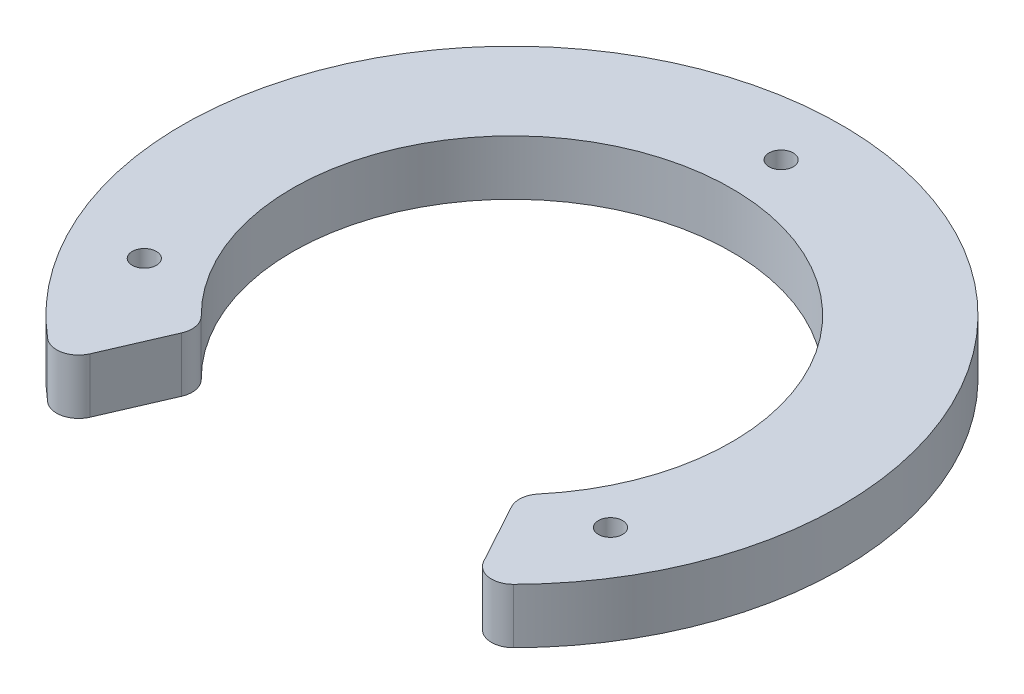
ISO-10303-21;
HEADER;
FILE_DESCRIPTION(('STEP AP214'),'2;1');
FILE_NAME('part.step','',(''),(''),'','','');
FILE_SCHEMA(('AUTOMOTIVE_DESIGN { 1 0 10303 214 1 1 1 1 }'));
ENDSEC;
DATA;
#1=APPLICATION_CONTEXT('core data for automotive mechanical design processes');
#2=APPLICATION_PROTOCOL_DEFINITION('international standard','automotive_design',2000,#1);
#3=PRODUCT_CONTEXT('',#1,'mechanical');
#4=PRODUCT('Part','Part','',(#3));
#5=PRODUCT_RELATED_PRODUCT_CATEGORY('part','',(#4));
#6=PRODUCT_DEFINITION_FORMATION('','',#4);
#7=PRODUCT_DEFINITION_CONTEXT('part definition',#1,'design');
#8=PRODUCT_DEFINITION('design','',#6,#7);
#9=PRODUCT_DEFINITION_SHAPE('','',#8);
#10=(LENGTH_UNIT() NAMED_UNIT(*) SI_UNIT(.MILLI.,.METRE.));
#11=(NAMED_UNIT(*) PLANE_ANGLE_UNIT() SI_UNIT($,.RADIAN.));
#12=(NAMED_UNIT(*) SI_UNIT($,.STERADIAN.) SOLID_ANGLE_UNIT());
#13=UNCERTAINTY_MEASURE_WITH_UNIT(LENGTH_MEASURE(1.E-05),#10,'distance_accuracy_value','');
#14=(GEOMETRIC_REPRESENTATION_CONTEXT(3) GLOBAL_UNCERTAINTY_ASSIGNED_CONTEXT((#13)) GLOBAL_UNIT_ASSIGNED_CONTEXT((#10,
#11,#12)) REPRESENTATION_CONTEXT('',''));
#15=CARTESIAN_POINT('',(0.,0.,0.));
#16=DIRECTION('',(0.,0.,1.));
#17=DIRECTION('',(1.,0.,0.));
#18=AXIS2_PLACEMENT_3D('',#15,#16,#17);
#19=CARTESIAN_POINT('',(0.,5.,0.));
#20=DIRECTION('',(0.,1.,0.));
#21=DIRECTION('',(0.,0.,1.));
#22=AXIS2_PLACEMENT_3D('',#19,#20,#21);
#23=PLANE('',#22);
#24=CARTESIAN_POINT('',(0.,5.,0.));
#25=DIRECTION('',(0.,1.,0.));
#26=DIRECTION('',(0.,0.,1.));
#27=AXIS2_PLACEMENT_3D('',#24,#25,#26);
#28=CIRCLE('',#27,20.);
#29=CARTESIAN_POINT('',(15.3041006050472,5.,12.8757331702157));
#30=VERTEX_POINT('',#29);
#31=CARTESIAN_POINT('',(-14.0733854628209,5.,14.2105531776515));
#32=VERTEX_POINT('',#31);
#33=EDGE_CURVE('E151',#30,#32,#28,.T.);
#34=ORIENTED_EDGE('',*,*,#33,.F.);
#35=CARTESIAN_POINT('',(16.8345106655519,5.,14.1633064872373));
#36=DIRECTION('',(0.,1.,0.));
#37=DIRECTION('',(0.,0.,1.));
#38=AXIS2_PLACEMENT_3D('',#35,#36,#37);
#39=CIRCLE('',#38,2.);
#40=CARTESIAN_POINT('',(15.07857060836,5.,15.1207376939298));
#41=VERTEX_POINT('',#40);
#42=EDGE_CURVE('E113',#30,#41,#39,.T.);
#43=ORIENTED_EDGE('',*,*,#42,.T.);
#44=DIRECTION('',(-0.478715603346275,0.,-0.877970028595972));
#45=VECTOR('',#44,1.);
#46=CARTESIAN_POINT('',(19.3391276928733,5.,22.9346493341133));
#47=LINE('',#46,#45);
#48=CARTESIAN_POINT('',(18.1131077432541,5.,20.6861143736855));
#49=VERTEX_POINT('',#48);
#50=EDGE_CURVE('E121',#49,#41,#47,.T.);
#51=ORIENTED_EDGE('',*,*,#50,.F.);
#52=CARTESIAN_POINT('',(19.869047800446,5.,19.7286831669929));
#53=DIRECTION('',(0.,1.,0.));
#54=DIRECTION('',(0.,0.,1.));
#55=AXIS2_PLACEMENT_3D('',#52,#53,#54);
#56=CIRCLE('',#55,2.);
#57=CARTESIAN_POINT('',(21.2882655004779,5.,21.1378748217781));
#58=VERTEX_POINT('',#57);
#59=EDGE_CURVE('E64',#49,#58,#56,.T.);
#60=ORIENTED_EDGE('',*,*,#59,.T.);
#61=CARTESIAN_POINT('',(0.,5.,0.));
#62=DIRECTION('',(0.,1.,0.));
#63=DIRECTION('',(0.,0.,1.));
#64=AXIS2_PLACEMENT_3D('',#61,#62,#63);
#65=CIRCLE('',#64,30.);
#66=CARTESIAN_POINT('',(-19.2836282905954,5.,22.98133329357));
#67=VERTEX_POINT('',#66);
#68=EDGE_CURVE('E126',#58,#67,#65,.T.);
#69=ORIENTED_EDGE('',*,*,#68,.T.);
#70=CARTESIAN_POINT('',(-17.9980530712223,5.,21.449244407332));
#71=DIRECTION('',(0.,1.,0.));
#72=DIRECTION('',(0.,0.,1.));
#73=AXIS2_PLACEMENT_3D('',#70,#71,#72);
#74=CIRCLE('',#73,2.);
#75=CARTESIAN_POINT('',(-16.1625223383157,5.,22.2434905458529));
#76=VERTEX_POINT('',#75);
#77=EDGE_CURVE('E56',#67,#76,#74,.T.);
#78=ORIENTED_EDGE('',*,*,#77,.T.);
#79=DIRECTION('',(-0.397123069260438,0.,0.917765366453305));
#80=VECTOR('',#79,1.);
#81=CARTESIAN_POINT('',(-13.0832174698103,5.,15.1271087996897));
#82=LINE('',#81,#80);
#83=CARTESIAN_POINT('',(-13.6451932761963,5.,16.4258546339376));
#84=VERTEX_POINT('',#83);
#85=EDGE_CURVE('E131',#84,#76,#82,.T.);
#86=ORIENTED_EDGE('',*,*,#85,.F.);
#87=CARTESIAN_POINT('',(-15.4807240091029,5.,15.6316084954167));
#88=DIRECTION('',(0.,1.,0.));
#89=DIRECTION('',(0.,0.,1.));
#90=AXIS2_PLACEMENT_3D('',#87,#88,#89);
#91=CIRCLE('',#90,2.);
#92=EDGE_CURVE('E114',#84,#32,#91,.T.);
#93=ORIENTED_EDGE('',*,*,#92,.T.);
#94=EDGE_LOOP('',(#34,#43,#51,#60,#69,#78,#86,#93));
#95=FACE_BOUND('',#94,.T.);
#96=CARTESIAN_POINT('',(21.2176223927188,5.,12.25));
#97=DIRECTION('',(0.,1.,0.));
#98=DIRECTION('',(0.,0.,1.));
#99=AXIS2_PLACEMENT_3D('',#96,#97,#98);
#100=CIRCLE('',#99,1.1);
#101=CARTESIAN_POINT('',(21.2176223927188,5.,13.35));
#102=VERTEX_POINT('',#101);
#103=EDGE_CURVE('E165',#102,#102,#100,.T.);
#104=ORIENTED_EDGE('',*,*,#103,.F.);
#105=EDGE_LOOP('',(#104));
#106=FACE_BOUND('',#105,.T.);
#107=CARTESIAN_POINT('',(0.,5.,-24.5));
#108=DIRECTION('',(0.,1.,0.));
#109=DIRECTION('',(0.,0.,1.));
#110=AXIS2_PLACEMENT_3D('',#107,#108,#109);
#111=CIRCLE('',#110,1.1);
#112=CARTESIAN_POINT('',(0.,5.,-23.4));
#113=VERTEX_POINT('',#112);
#114=EDGE_CURVE('E152',#113,#113,#111,.T.);
#115=ORIENTED_EDGE('',*,*,#114,.F.);
#116=EDGE_LOOP('',(#115));
#117=FACE_BOUND('',#116,.T.);
#118=CARTESIAN_POINT('',(-21.2176223927187,5.,12.25));
#119=DIRECTION('',(0.,1.,0.));
#120=DIRECTION('',(0.,0.,1.));
#121=AXIS2_PLACEMENT_3D('',#118,#119,#120);
#122=CIRCLE('',#121,1.1);
#123=CARTESIAN_POINT('',(-21.2176223927187,5.,13.35));
#124=VERTEX_POINT('',#123);
#125=EDGE_CURVE('E171',#124,#124,#122,.T.);
#126=ORIENTED_EDGE('',*,*,#125,.F.);
#127=EDGE_LOOP('',(#126));
#128=FACE_BOUND('',#127,.T.);
#129=ADVANCED_FACE('F41',(#95,#106,#117,#128),#23,.T.);
#130=CARTESIAN_POINT('',(0.,0.,0.));
#131=DIRECTION('',(0.,1.,0.));
#132=DIRECTION('',(0.,0.,1.));
#133=AXIS2_PLACEMENT_3D('',#130,#131,#132);
#134=PLANE('',#133);
#135=DIRECTION('',(-0.478715603346275,0.,-0.877970028595972));
#136=VECTOR('',#135,1.);
#137=CARTESIAN_POINT('',(5.2678201715915,0.,-2.87229362008619));
#138=LINE('',#137,#136);
#139=CARTESIAN_POINT('',(18.1131077432541,0.,20.6861143736855));
#140=VERTEX_POINT('',#139);
#141=CARTESIAN_POINT('',(15.07857060836,0.,15.1207376939298));
#142=VERTEX_POINT('',#141);
#143=EDGE_CURVE('E124',#140,#142,#138,.T.);
#144=ORIENTED_EDGE('',*,*,#143,.T.);
#145=CARTESIAN_POINT('',(16.8345106655519,0.,14.1633064872373));
#146=DIRECTION('',(0.,1.,0.));
#147=DIRECTION('',(0.,0.,1.));
#148=AXIS2_PLACEMENT_3D('',#145,#146,#147);
#149=CIRCLE('',#148,2.);
#150=CARTESIAN_POINT('',(15.3041006050472,0.,12.8757331702157));
#151=VERTEX_POINT('',#150);
#152=EDGE_CURVE('E220',#142,#151,#149,.F.);
#153=ORIENTED_EDGE('',*,*,#152,.T.);
#154=CARTESIAN_POINT('',(0.,0.,0.));
#155=DIRECTION('',(0.,1.,0.));
#156=DIRECTION('',(0.,0.,1.));
#157=AXIS2_PLACEMENT_3D('',#154,#155,#156);
#158=CIRCLE('',#157,20.);
#159=CARTESIAN_POINT('',(-14.0733854628209,0.,14.2105531776515));
#160=VERTEX_POINT('',#159);
#161=EDGE_CURVE('E146',#151,#160,#158,.T.);
#162=ORIENTED_EDGE('',*,*,#161,.T.);
#163=CARTESIAN_POINT('',(-15.4807240091029,0.,15.6316084954167));
#164=DIRECTION('',(0.,1.,0.));
#165=DIRECTION('',(0.,0.,1.));
#166=AXIS2_PLACEMENT_3D('',#163,#164,#165);
#167=CIRCLE('',#166,2.);
#168=CARTESIAN_POINT('',(-13.6451932761963,0.,16.4258546339376));
#169=VERTEX_POINT('',#168);
#170=EDGE_CURVE('E213',#160,#169,#167,.F.);
#171=ORIENTED_EDGE('',*,*,#170,.T.);
#172=DIRECTION('',(-0.397123069260438,0.,0.917765366453305));
#173=VECTOR('',#172,1.);
#174=CARTESIAN_POINT('',(-5.50659219871929,0.,-2.3827384155624));
#175=LINE('',#174,#173);
#176=CARTESIAN_POINT('',(-16.1625223383157,0.,22.2434905458529));
#177=VERTEX_POINT('',#176);
#178=EDGE_CURVE('E138',#169,#177,#175,.T.);
#179=ORIENTED_EDGE('',*,*,#178,.T.);
#180=CARTESIAN_POINT('',(-17.9980530712223,0.,21.449244407332));
#181=DIRECTION('',(0.,1.,0.));
#182=DIRECTION('',(0.,0.,1.));
#183=AXIS2_PLACEMENT_3D('',#180,#181,#182);
#184=CIRCLE('',#183,2.);
#185=CARTESIAN_POINT('',(-19.2836282905954,0.,22.98133329357));
#186=VERTEX_POINT('',#185);
#187=EDGE_CURVE('E218',#177,#186,#184,.F.);
#188=ORIENTED_EDGE('',*,*,#187,.T.);
#189=CARTESIAN_POINT('',(0.,0.,0.));
#190=DIRECTION('',(0.,1.,0.));
#191=DIRECTION('',(0.,0.,1.));
#192=AXIS2_PLACEMENT_3D('',#189,#190,#191);
#193=CIRCLE('',#192,30.);
#194=CARTESIAN_POINT('',(21.2882655004779,0.,21.1378748217781));
#195=VERTEX_POINT('',#194);
#196=EDGE_CURVE('E155',#195,#186,#193,.T.);
#197=ORIENTED_EDGE('',*,*,#196,.F.);
#198=CARTESIAN_POINT('',(19.869047800446,0.,19.7286831669929));
#199=DIRECTION('',(0.,1.,0.));
#200=DIRECTION('',(0.,0.,1.));
#201=AXIS2_PLACEMENT_3D('',#198,#199,#200);
#202=CIRCLE('',#201,2.);
#203=EDGE_CURVE('E217',#195,#140,#202,.F.);
#204=ORIENTED_EDGE('',*,*,#203,.T.);
#205=EDGE_LOOP('',(#144,#153,#162,#171,#179,#188,#197,#204));
#206=FACE_BOUND('',#205,.T.);
#207=CARTESIAN_POINT('',(0.,0.,-24.5));
#208=DIRECTION('',(0.,1.,0.));
#209=DIRECTION('',(0.,0.,1.));
#210=AXIS2_PLACEMENT_3D('',#207,#208,#209);
#211=CIRCLE('',#210,1.1);
#212=CARTESIAN_POINT('',(0.,0.,-23.4));
#213=VERTEX_POINT('',#212);
#214=EDGE_CURVE('E161',#213,#213,#211,.T.);
#215=ORIENTED_EDGE('',*,*,#214,.T.);
#216=EDGE_LOOP('',(#215));
#217=FACE_BOUND('',#216,.T.);
#218=CARTESIAN_POINT('',(21.2176223927188,0.,12.25));
#219=DIRECTION('',(0.,1.,0.));
#220=DIRECTION('',(0.,0.,1.));
#221=AXIS2_PLACEMENT_3D('',#218,#219,#220);
#222=CIRCLE('',#221,1.1);
#223=CARTESIAN_POINT('',(21.2176223927188,0.,13.35));
#224=VERTEX_POINT('',#223);
#225=EDGE_CURVE('E167',#224,#224,#222,.T.);
#226=ORIENTED_EDGE('',*,*,#225,.T.);
#227=EDGE_LOOP('',(#226));
#228=FACE_BOUND('',#227,.T.);
#229=CARTESIAN_POINT('',(-21.2176223927187,0.,12.25));
#230=DIRECTION('',(0.,1.,0.));
#231=DIRECTION('',(0.,0.,1.));
#232=AXIS2_PLACEMENT_3D('',#229,#230,#231);
#233=CIRCLE('',#232,1.1);
#234=CARTESIAN_POINT('',(-21.2176223927187,0.,13.35));
#235=VERTEX_POINT('',#234);
#236=EDGE_CURVE('E173',#235,#235,#233,.T.);
#237=ORIENTED_EDGE('',*,*,#236,.T.);
#238=EDGE_LOOP('',(#237));
#239=FACE_BOUND('',#238,.T.);
#240=ADVANCED_FACE('F183',(#206,#217,#228,#239),#134,.F.);
#241=CARTESIAN_POINT('',(0.,5.,0.));
#242=DIRECTION('',(0.,-1.,0.));
#243=DIRECTION('',(0.,0.,-1.));
#244=AXIS2_PLACEMENT_3D('',#241,#242,#243);
#245=CYLINDRICAL_SURFACE('',#244,30.);
#246=ORIENTED_EDGE('',*,*,#68,.F.);
#247=DIRECTION('',(0.,-1.,0.));
#248=VECTOR('',#247,1.);
#249=CARTESIAN_POINT('',(21.2882655004779,5.,21.1378748217781));
#250=LINE('',#249,#248);
#251=EDGE_CURVE('E112',#58,#195,#250,.T.);
#252=ORIENTED_EDGE('',*,*,#251,.T.);
#253=ORIENTED_EDGE('',*,*,#196,.T.);
#254=DIRECTION('',(0.,-1.,0.));
#255=VECTOR('',#254,1.);
#256=CARTESIAN_POINT('',(-19.2836282905954,5.,22.98133329357));
#257=LINE('',#256,#255);
#258=EDGE_CURVE('E231',#186,#67,#257,.F.);
#259=ORIENTED_EDGE('',*,*,#258,.T.);
#260=EDGE_LOOP('',(#246,#252,#253,#259));
#261=FACE_BOUND('',#260,.T.);
#262=ADVANCED_FACE('F188',(#261),#245,.T.);
#263=CARTESIAN_POINT('',(0.,5.,0.));
#264=DIRECTION('',(0.,-1.,0.));
#265=DIRECTION('',(0.,0.,-1.));
#266=AXIS2_PLACEMENT_3D('',#263,#264,#265);
#267=CYLINDRICAL_SURFACE('',#266,20.);
#268=ORIENTED_EDGE('',*,*,#161,.F.);
#269=DIRECTION('',(0.,-1.,0.));
#270=VECTOR('',#269,1.);
#271=CARTESIAN_POINT('',(15.3041006050472,5.,12.8757331702157));
#272=LINE('',#271,#270);
#273=EDGE_CURVE('E226',#151,#30,#272,.F.);
#274=ORIENTED_EDGE('',*,*,#273,.T.);
#275=ORIENTED_EDGE('',*,*,#33,.T.);
#276=DIRECTION('',(0.,-1.,0.));
#277=VECTOR('',#276,1.);
#278=CARTESIAN_POINT('',(-14.0733854628209,5.,14.2105531776515));
#279=LINE('',#278,#277);
#280=EDGE_CURVE('E214',#32,#160,#279,.T.);
#281=ORIENTED_EDGE('',*,*,#280,.T.);
#282=EDGE_LOOP('',(#268,#274,#275,#281));
#283=FACE_BOUND('',#282,.T.);
#284=ADVANCED_FACE('F192',(#283),#267,.F.);
#285=CARTESIAN_POINT('',(0.,5.,-24.5));
#286=DIRECTION('',(0.,-1.,0.));
#287=DIRECTION('',(0.,0.,-1.));
#288=AXIS2_PLACEMENT_3D('',#285,#286,#287);
#289=CYLINDRICAL_SURFACE('',#288,1.1);
#290=ORIENTED_EDGE('',*,*,#114,.T.);
#291=EDGE_LOOP('',(#290));
#292=FACE_BOUND('',#291,.T.);
#293=ORIENTED_EDGE('',*,*,#214,.F.);
#294=EDGE_LOOP('',(#293));
#295=FACE_BOUND('',#294,.T.);
#296=ADVANCED_FACE('F243',(#292,#295),#289,.F.);
#297=CARTESIAN_POINT('',(21.2176223927188,5.,12.25));
#298=DIRECTION('',(0.,-1.,0.));
#299=DIRECTION('',(0.,0.,-1.));
#300=AXIS2_PLACEMENT_3D('',#297,#298,#299);
#301=CYLINDRICAL_SURFACE('',#300,1.1);
#302=ORIENTED_EDGE('',*,*,#103,.T.);
#303=EDGE_LOOP('',(#302));
#304=FACE_BOUND('',#303,.T.);
#305=ORIENTED_EDGE('',*,*,#225,.F.);
#306=EDGE_LOOP('',(#305));
#307=FACE_BOUND('',#306,.T.);
#308=ADVANCED_FACE('F247',(#304,#307),#301,.F.);
#309=CARTESIAN_POINT('',(-21.2176223927187,5.,12.25));
#310=DIRECTION('',(0.,-1.,0.));
#311=DIRECTION('',(0.,0.,-1.));
#312=AXIS2_PLACEMENT_3D('',#309,#310,#311);
#313=CYLINDRICAL_SURFACE('',#312,1.1);
#314=ORIENTED_EDGE('',*,*,#125,.T.);
#315=EDGE_LOOP('',(#314));
#316=FACE_BOUND('',#315,.T.);
#317=ORIENTED_EDGE('',*,*,#236,.F.);
#318=EDGE_LOOP('',(#317));
#319=FACE_BOUND('',#318,.T.);
#320=ADVANCED_FACE('F179',(#316,#319),#313,.F.);
#321=CARTESIAN_POINT('',(19.3391276928733,-5.,22.9346493341133));
#322=DIRECTION('',(0.877970028595972,0.,-0.478715603346275));
#323=DIRECTION('',(-0.478715603346275,0.,-0.877970028595972));
#324=AXIS2_PLACEMENT_3D('',#321,#322,#323);
#325=PLANE('',#324);
#326=ORIENTED_EDGE('',*,*,#50,.T.);
#327=DIRECTION('',(0.,1.,0.));
#328=VECTOR('',#327,1.);
#329=CARTESIAN_POINT('',(15.07857060836,0.,15.1207376939298));
#330=LINE('',#329,#328);
#331=EDGE_CURVE('E125',#41,#142,#330,.F.);
#332=ORIENTED_EDGE('',*,*,#331,.T.);
#333=ORIENTED_EDGE('',*,*,#143,.F.);
#334=DIRECTION('',(0.,-1.,0.));
#335=VECTOR('',#334,1.);
#336=CARTESIAN_POINT('',(18.1131077432541,-5.,20.6861143736855));
#337=LINE('',#336,#335);
#338=EDGE_CURVE('E111',#140,#49,#337,.F.);
#339=ORIENTED_EDGE('',*,*,#338,.T.);
#340=EDGE_LOOP('',(#326,#332,#333,#339));
#341=FACE_BOUND('',#340,.T.);
#342=ADVANCED_FACE('F119',(#341),#325,.F.);
#343=CARTESIAN_POINT('',(-13.0832174698103,-5.,15.1271087996897));
#344=DIRECTION('',(-0.917765366453305,0.,-0.397123069260438));
#345=DIRECTION('',(-0.397123069260438,0.,0.917765366453305));
#346=AXIS2_PLACEMENT_3D('',#343,#344,#345);
#347=PLANE('',#346);
#348=ORIENTED_EDGE('',*,*,#178,.F.);
#349=DIRECTION('',(0.,1.,0.));
#350=VECTOR('',#349,1.);
#351=CARTESIAN_POINT('',(-13.6451932761963,5.,16.4258546339376));
#352=LINE('',#351,#350);
#353=EDGE_CURVE('E12',#169,#84,#352,.T.);
#354=ORIENTED_EDGE('',*,*,#353,.T.);
#355=ORIENTED_EDGE('',*,*,#85,.T.);
#356=DIRECTION('',(0.,-1.,0.));
#357=VECTOR('',#356,1.);
#358=CARTESIAN_POINT('',(-16.1625223383157,-5.,22.2434905458529));
#359=LINE('',#358,#357);
#360=EDGE_CURVE('E49',#76,#177,#359,.T.);
#361=ORIENTED_EDGE('',*,*,#360,.T.);
#362=EDGE_LOOP('',(#348,#354,#355,#361));
#363=FACE_BOUND('',#362,.T.);
#364=ADVANCED_FACE('F201',(#363),#347,.F.);
#365=CARTESIAN_POINT('',(16.8345106655519,5.,14.1633064872373));
#366=DIRECTION('',(0.,-1.,0.));
#367=DIRECTION('',(0.,0.,-1.));
#368=AXIS2_PLACEMENT_3D('',#365,#366,#367);
#369=CYLINDRICAL_SURFACE('',#368,2.);
#370=ORIENTED_EDGE('',*,*,#42,.F.);
#371=ORIENTED_EDGE('',*,*,#273,.F.);
#372=ORIENTED_EDGE('',*,*,#152,.F.);
#373=ORIENTED_EDGE('',*,*,#331,.F.);
#374=EDGE_LOOP('',(#370,#371,#372,#373));
#375=FACE_BOUND('',#374,.T.);
#376=ADVANCED_FACE('F198',(#375),#369,.T.);
#377=CARTESIAN_POINT('',(19.869047800446,5.,19.7286831669929));
#378=DIRECTION('',(0.,-1.,0.));
#379=DIRECTION('',(0.,0.,-1.));
#380=AXIS2_PLACEMENT_3D('',#377,#378,#379);
#381=CYLINDRICAL_SURFACE('',#380,2.);
#382=ORIENTED_EDGE('',*,*,#203,.F.);
#383=ORIENTED_EDGE('',*,*,#251,.F.);
#384=ORIENTED_EDGE('',*,*,#59,.F.);
#385=ORIENTED_EDGE('',*,*,#338,.F.);
#386=EDGE_LOOP('',(#382,#383,#384,#385));
#387=FACE_BOUND('',#386,.T.);
#388=ADVANCED_FACE('F110',(#387),#381,.T.);
#389=CARTESIAN_POINT('',(-15.4807240091029,5.,15.6316084954167));
#390=DIRECTION('',(0.,-1.,0.));
#391=DIRECTION('',(0.,0.,-1.));
#392=AXIS2_PLACEMENT_3D('',#389,#390,#391);
#393=CYLINDRICAL_SURFACE('',#392,2.);
#394=ORIENTED_EDGE('',*,*,#170,.F.);
#395=ORIENTED_EDGE('',*,*,#280,.F.);
#396=ORIENTED_EDGE('',*,*,#92,.F.);
#397=ORIENTED_EDGE('',*,*,#353,.F.);
#398=EDGE_LOOP('',(#394,#395,#396,#397));
#399=FACE_BOUND('',#398,.T.);
#400=ADVANCED_FACE('F204',(#399),#393,.T.);
#401=CARTESIAN_POINT('',(-17.9980530712223,5.,21.449244407332));
#402=DIRECTION('',(0.,-1.,0.));
#403=DIRECTION('',(0.,0.,-1.));
#404=AXIS2_PLACEMENT_3D('',#401,#402,#403);
#405=CYLINDRICAL_SURFACE('',#404,2.);
#406=ORIENTED_EDGE('',*,*,#187,.F.);
#407=ORIENTED_EDGE('',*,*,#360,.F.);
#408=ORIENTED_EDGE('',*,*,#77,.F.);
#409=ORIENTED_EDGE('',*,*,#258,.F.);
#410=EDGE_LOOP('',(#406,#407,#408,#409));
#411=FACE_BOUND('',#410,.T.);
#412=ADVANCED_FACE('F43',(#411),#405,.T.);
#413=CLOSED_SHELL('',(#129,#240,#262,#284,#296,#308,#320,#342,#364,#376,#388,#400,#412));
#414=MANIFOLD_SOLID_BREP('B2',#413);
#415=ADVANCED_BREP_SHAPE_REPRESENTATION('',(#18,#414),#14);
#416=SHAPE_DEFINITION_REPRESENTATION(#9,#415);
ENDSEC;
END-ISO-10303-21;
